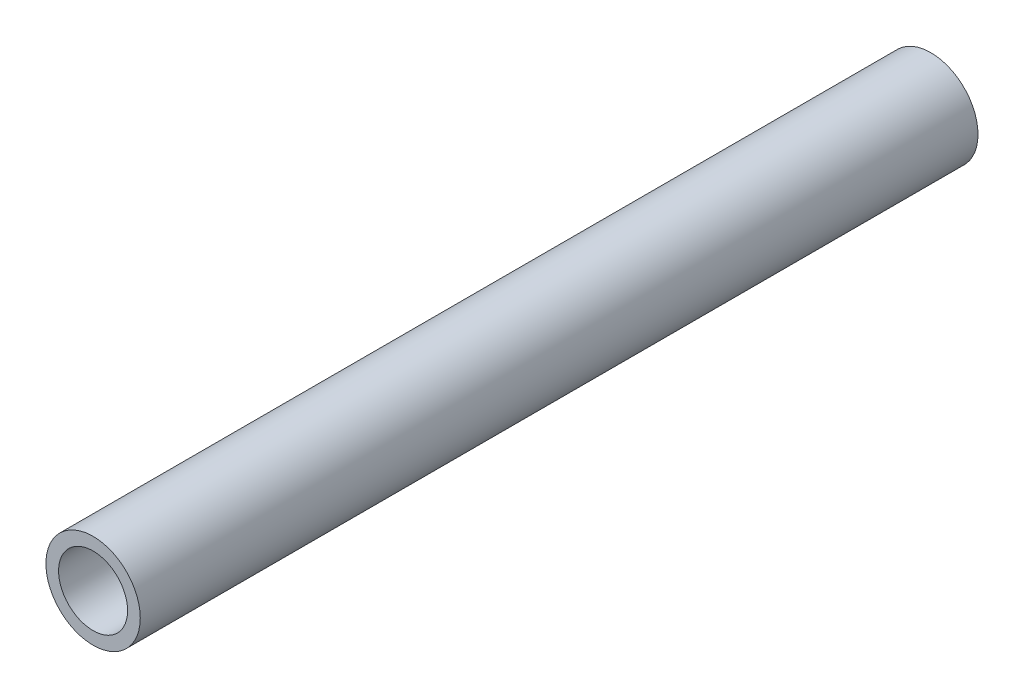
ISO-10303-21;
HEADER;
FILE_DESCRIPTION(('STEP AP214'),'2;1');
FILE_NAME('part.step','',(''),(''),'','','');
FILE_SCHEMA(('AUTOMOTIVE_DESIGN { 1 0 10303 214 1 1 1 1 }'));
ENDSEC;
DATA;
#1=APPLICATION_CONTEXT('core data for automotive mechanical design processes');
#2=APPLICATION_PROTOCOL_DEFINITION('international standard','automotive_design',2000,#1);
#3=PRODUCT_CONTEXT('',#1,'mechanical');
#4=PRODUCT('Part','Part','',(#3));
#5=PRODUCT_RELATED_PRODUCT_CATEGORY('part','',(#4));
#6=PRODUCT_DEFINITION_FORMATION('','',#4);
#7=PRODUCT_DEFINITION_CONTEXT('part definition',#1,'design');
#8=PRODUCT_DEFINITION('design','',#6,#7);
#9=PRODUCT_DEFINITION_SHAPE('','',#8);
#10=(LENGTH_UNIT() NAMED_UNIT(*) SI_UNIT(.MILLI.,.METRE.));
#11=(NAMED_UNIT(*) PLANE_ANGLE_UNIT() SI_UNIT($,.RADIAN.));
#12=(NAMED_UNIT(*) SI_UNIT($,.STERADIAN.) SOLID_ANGLE_UNIT());
#13=UNCERTAINTY_MEASURE_WITH_UNIT(LENGTH_MEASURE(1.E-05),#10,'distance_accuracy_value','');
#14=(GEOMETRIC_REPRESENTATION_CONTEXT(3) GLOBAL_UNCERTAINTY_ASSIGNED_CONTEXT((#13)) GLOBAL_UNIT_ASSIGNED_CONTEXT((#10,
#11,#12)) REPRESENTATION_CONTEXT('',''));
#15=CARTESIAN_POINT('',(0.,0.,0.));
#16=DIRECTION('',(0.,0.,1.));
#17=DIRECTION('',(1.,0.,0.));
#18=AXIS2_PLACEMENT_3D('',#15,#16,#17);
#19=CARTESIAN_POINT('',(0.,0.,95.));
#20=DIRECTION('',(0.,0.,1.));
#21=DIRECTION('',(1.,0.,0.));
#22=AXIS2_PLACEMENT_3D('',#19,#20,#21);
#23=PLANE('',#22);
#24=CARTESIAN_POINT('',(0.,0.,95.));
#25=DIRECTION('',(0.,0.,1.));
#26=DIRECTION('',(1.,0.,0.));
#27=AXIS2_PLACEMENT_3D('',#24,#25,#26);
#28=CIRCLE('',#27,10.7);
#29=CARTESIAN_POINT('',(10.7,0.,95.));
#30=VERTEX_POINT('',#29);
#31=EDGE_CURVE('E10',#30,#30,#28,.T.);
#32=ORIENTED_EDGE('',*,*,#31,.T.);
#33=EDGE_LOOP('',(#32));
#34=FACE_BOUND('',#33,.T.);
#35=CARTESIAN_POINT('',(0.,0.,95.));
#36=DIRECTION('',(0.,0.,1.));
#37=DIRECTION('',(1.,0.,0.));
#38=AXIS2_PLACEMENT_3D('',#35,#36,#37);
#39=CIRCLE('',#38,7.825);
#40=CARTESIAN_POINT('',(7.825,0.,95.));
#41=VERTEX_POINT('',#40);
#42=EDGE_CURVE('E42',#41,#41,#39,.T.);
#43=ORIENTED_EDGE('',*,*,#42,.F.);
#44=EDGE_LOOP('',(#43));
#45=FACE_BOUND('',#44,.T.);
#46=ADVANCED_FACE('F31',(#34,#45),#23,.T.);
#47=CARTESIAN_POINT('',(0.,0.,-95.));
#48=DIRECTION('',(0.,0.,1.));
#49=DIRECTION('',(1.,0.,0.));
#50=AXIS2_PLACEMENT_3D('',#47,#48,#49);
#51=PLANE('',#50);
#52=CARTESIAN_POINT('',(0.,0.,-95.));
#53=DIRECTION('',(0.,0.,1.));
#54=DIRECTION('',(1.,0.,0.));
#55=AXIS2_PLACEMENT_3D('',#52,#53,#54);
#56=CIRCLE('',#55,10.7);
#57=CARTESIAN_POINT('',(10.7,0.,-95.));
#58=VERTEX_POINT('',#57);
#59=EDGE_CURVE('E35',#58,#58,#56,.T.);
#60=ORIENTED_EDGE('',*,*,#59,.F.);
#61=EDGE_LOOP('',(#60));
#62=FACE_BOUND('',#61,.T.);
#63=CARTESIAN_POINT('',(0.,0.,-95.));
#64=DIRECTION('',(0.,0.,1.));
#65=DIRECTION('',(1.,0.,0.));
#66=AXIS2_PLACEMENT_3D('',#63,#64,#65);
#67=CIRCLE('',#66,7.825);
#68=CARTESIAN_POINT('',(7.825,0.,-95.));
#69=VERTEX_POINT('',#68);
#70=EDGE_CURVE('E44',#69,#69,#67,.T.);
#71=ORIENTED_EDGE('',*,*,#70,.T.);
#72=EDGE_LOOP('',(#71));
#73=FACE_BOUND('',#72,.T.);
#74=ADVANCED_FACE('F54',(#62,#73),#51,.F.);
#75=CARTESIAN_POINT('',(0.,0.,95.));
#76=DIRECTION('',(0.,0.,-1.));
#77=DIRECTION('',(-1.,0.,0.));
#78=AXIS2_PLACEMENT_3D('',#75,#76,#77);
#79=CYLINDRICAL_SURFACE('',#78,10.7);
#80=ORIENTED_EDGE('',*,*,#31,.F.);
#81=EDGE_LOOP('',(#80));
#82=FACE_BOUND('',#81,.T.);
#83=ORIENTED_EDGE('',*,*,#59,.T.);
#84=EDGE_LOOP('',(#83));
#85=FACE_BOUND('',#84,.T.);
#86=ADVANCED_FACE('F33',(#82,#85),#79,.T.);
#87=CARTESIAN_POINT('',(0.,0.,95.));
#88=DIRECTION('',(0.,0.,-1.));
#89=DIRECTION('',(-1.,0.,0.));
#90=AXIS2_PLACEMENT_3D('',#87,#88,#89);
#91=CYLINDRICAL_SURFACE('',#90,7.825);
#92=ORIENTED_EDGE('',*,*,#42,.T.);
#93=EDGE_LOOP('',(#92));
#94=FACE_BOUND('',#93,.T.);
#95=ORIENTED_EDGE('',*,*,#70,.F.);
#96=EDGE_LOOP('',(#95));
#97=FACE_BOUND('',#96,.T.);
#98=ADVANCED_FACE('F50',(#94,#97),#91,.F.);
#99=CLOSED_SHELL('',(#46,#74,#86,#98));
#100=MANIFOLD_SOLID_BREP('B2',#99);
#101=ADVANCED_BREP_SHAPE_REPRESENTATION('',(#18,#100),#14);
#102=SHAPE_DEFINITION_REPRESENTATION(#9,#101);
ENDSEC;
END-ISO-10303-21;
